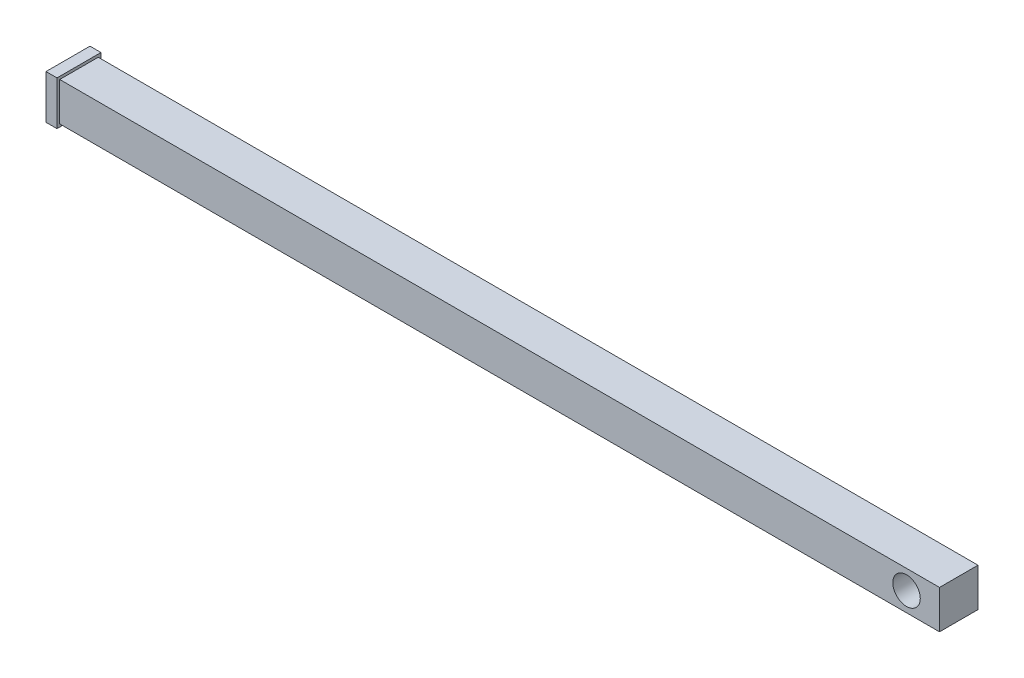
ISO-10303-21;
HEADER;
FILE_DESCRIPTION(('STEP AP214'),'2;1');
FILE_NAME('part.step','',(''),(''),'','','');
FILE_SCHEMA(('AUTOMOTIVE_DESIGN { 1 0 10303 214 1 1 1 1 }'));
ENDSEC;
DATA;
#1=APPLICATION_CONTEXT('core data for automotive mechanical design processes');
#2=APPLICATION_PROTOCOL_DEFINITION('international standard','automotive_design',2000,#1);
#3=PRODUCT_CONTEXT('',#1,'mechanical');
#4=PRODUCT('Part','Part','',(#3));
#5=PRODUCT_RELATED_PRODUCT_CATEGORY('part','',(#4));
#6=PRODUCT_DEFINITION_FORMATION('','',#4);
#7=PRODUCT_DEFINITION_CONTEXT('part definition',#1,'design');
#8=PRODUCT_DEFINITION('design','',#6,#7);
#9=PRODUCT_DEFINITION_SHAPE('','',#8);
#10=(LENGTH_UNIT() NAMED_UNIT(*) SI_UNIT(.MILLI.,.METRE.));
#11=(NAMED_UNIT(*) PLANE_ANGLE_UNIT() SI_UNIT($,.RADIAN.));
#12=(NAMED_UNIT(*) SI_UNIT($,.STERADIAN.) SOLID_ANGLE_UNIT());
#13=UNCERTAINTY_MEASURE_WITH_UNIT(LENGTH_MEASURE(1.E-05),#10,'distance_accuracy_value','');
#14=(GEOMETRIC_REPRESENTATION_CONTEXT(3) GLOBAL_UNCERTAINTY_ASSIGNED_CONTEXT((#13)) GLOBAL_UNIT_ASSIGNED_CONTEXT((#10,
#11,#12)) REPRESENTATION_CONTEXT('',''));
#15=CARTESIAN_POINT('',(0.,0.,0.));
#16=DIRECTION('',(0.,0.,1.));
#17=DIRECTION('',(1.,0.,0.));
#18=AXIS2_PLACEMENT_3D('',#15,#16,#17);
#19=CARTESIAN_POINT('',(800.,17.5,-17.5));
#20=DIRECTION('',(0.,0.,1.));
#21=DIRECTION('',(0.,-1.,0.));
#22=AXIS2_PLACEMENT_3D('',#19,#20,#21);
#23=PLANE('',#22);
#24=DIRECTION('',(0.,1.,0.));
#25=VECTOR('',#24,1.);
#26=CARTESIAN_POINT('',(0.,17.5,-17.5));
#27=LINE('',#26,#25);
#28=CARTESIAN_POINT('',(0.,-17.5,-17.5));
#29=VERTEX_POINT('',#28);
#30=CARTESIAN_POINT('',(0.,17.5,-17.5));
#31=VERTEX_POINT('',#30);
#32=EDGE_CURVE('E105',#29,#31,#27,.T.);
#33=ORIENTED_EDGE('',*,*,#32,.T.);
#34=DIRECTION('',(-1.,0.,0.));
#35=VECTOR('',#34,1.);
#36=CARTESIAN_POINT('',(800.,17.5,-17.5));
#37=LINE('',#36,#35);
#38=CARTESIAN_POINT('',(800.,17.5,-17.5));
#39=VERTEX_POINT('',#38);
#40=EDGE_CURVE('E11',#39,#31,#37,.T.);
#41=ORIENTED_EDGE('',*,*,#40,.F.);
#42=DIRECTION('',(0.,1.,0.));
#43=VECTOR('',#42,1.);
#44=CARTESIAN_POINT('',(800.,17.5,-17.5));
#45=LINE('',#44,#43);
#46=CARTESIAN_POINT('',(800.,-17.5,-17.5));
#47=VERTEX_POINT('',#46);
#48=EDGE_CURVE('E139',#47,#39,#45,.T.);
#49=ORIENTED_EDGE('',*,*,#48,.F.);
#50=DIRECTION('',(-1.,0.,0.));
#51=VECTOR('',#50,1.);
#52=CARTESIAN_POINT('',(800.,-17.5,-17.5));
#53=LINE('',#52,#51);
#54=EDGE_CURVE('E147',#47,#29,#53,.T.);
#55=ORIENTED_EDGE('',*,*,#54,.T.);
#56=EDGE_LOOP('',(#33,#41,#49,#55));
#57=FACE_BOUND('',#56,.T.);
#58=ADVANCED_FACE('F35',(#57),#23,.F.);
#59=CARTESIAN_POINT('',(800.,17.5,17.5));
#60=DIRECTION('',(0.,-1.,0.));
#61=DIRECTION('',(0.,0.,-1.));
#62=AXIS2_PLACEMENT_3D('',#59,#60,#61);
#63=PLANE('',#62);
#64=DIRECTION('',(0.,0.,1.));
#65=VECTOR('',#64,1.);
#66=CARTESIAN_POINT('',(0.,17.5,17.5));
#67=LINE('',#66,#65);
#68=CARTESIAN_POINT('',(0.,17.5,17.5));
#69=VERTEX_POINT('',#68);
#70=EDGE_CURVE('E150',#31,#69,#67,.T.);
#71=ORIENTED_EDGE('',*,*,#70,.T.);
#72=DIRECTION('',(-1.,0.,0.));
#73=VECTOR('',#72,1.);
#74=CARTESIAN_POINT('',(800.,17.5,17.5));
#75=LINE('',#74,#73);
#76=CARTESIAN_POINT('',(800.,17.5,17.5));
#77=VERTEX_POINT('',#76);
#78=EDGE_CURVE('E43',#77,#69,#75,.T.);
#79=ORIENTED_EDGE('',*,*,#78,.F.);
#80=DIRECTION('',(0.,0.,1.));
#81=VECTOR('',#80,1.);
#82=CARTESIAN_POINT('',(800.,17.5,17.5));
#83=LINE('',#82,#81);
#84=EDGE_CURVE('E141',#39,#77,#83,.T.);
#85=ORIENTED_EDGE('',*,*,#84,.F.);
#86=ORIENTED_EDGE('',*,*,#40,.T.);
#87=EDGE_LOOP('',(#71,#79,#85,#86));
#88=FACE_BOUND('',#87,.T.);
#89=ADVANCED_FACE('F170',(#88),#63,.F.);
#90=CARTESIAN_POINT('',(800.,17.5,17.5));
#91=DIRECTION('',(0.,0.,-1.));
#92=DIRECTION('',(0.,1.,0.));
#93=AXIS2_PLACEMENT_3D('',#90,#91,#92);
#94=PLANE('',#93);
#95=CARTESIAN_POINT('',(770.,0.,17.5));
#96=DIRECTION('',(0.,0.,1.));
#97=DIRECTION('',(1.,0.,0.));
#98=AXIS2_PLACEMENT_3D('',#95,#96,#97);
#99=CIRCLE('',#98,12.5);
#100=CARTESIAN_POINT('',(782.5,0.,17.5));
#101=VERTEX_POINT('',#100);
#102=EDGE_CURVE('E201',#101,#101,#99,.T.);
#103=ORIENTED_EDGE('',*,*,#102,.F.);
#104=EDGE_LOOP('',(#103));
#105=FACE_BOUND('',#104,.T.);
#106=DIRECTION('',(0.,-1.,0.));
#107=VECTOR('',#106,1.);
#108=CARTESIAN_POINT('',(0.,17.5,17.5));
#109=LINE('',#108,#107);
#110=CARTESIAN_POINT('',(0.,-17.5,17.5));
#111=VERTEX_POINT('',#110);
#112=EDGE_CURVE('E153',#69,#111,#109,.T.);
#113=ORIENTED_EDGE('',*,*,#112,.T.);
#114=DIRECTION('',(-1.,0.,0.));
#115=VECTOR('',#114,1.);
#116=CARTESIAN_POINT('',(800.,-17.5,17.5));
#117=LINE('',#116,#115);
#118=CARTESIAN_POINT('',(800.,-17.5,17.5));
#119=VERTEX_POINT('',#118);
#120=EDGE_CURVE('E160',#119,#111,#117,.T.);
#121=ORIENTED_EDGE('',*,*,#120,.F.);
#122=DIRECTION('',(0.,-1.,0.));
#123=VECTOR('',#122,1.);
#124=CARTESIAN_POINT('',(800.,17.5,17.5));
#125=LINE('',#124,#123);
#126=EDGE_CURVE('E144',#77,#119,#125,.T.);
#127=ORIENTED_EDGE('',*,*,#126,.F.);
#128=ORIENTED_EDGE('',*,*,#78,.T.);
#129=EDGE_LOOP('',(#113,#121,#127,#128));
#130=FACE_BOUND('',#129,.T.);
#131=ADVANCED_FACE('F166',(#105,#130),#94,.F.);
#132=CARTESIAN_POINT('',(800.,-17.5,17.5));
#133=DIRECTION('',(0.,1.,0.));
#134=DIRECTION('',(0.,0.,1.));
#135=AXIS2_PLACEMENT_3D('',#132,#133,#134);
#136=PLANE('',#135);
#137=DIRECTION('',(0.,0.,-1.));
#138=VECTOR('',#137,1.);
#139=CARTESIAN_POINT('',(0.,-17.5,17.5));
#140=LINE('',#139,#138);
#141=EDGE_CURVE('E142',#111,#29,#140,.T.);
#142=ORIENTED_EDGE('',*,*,#141,.T.);
#143=ORIENTED_EDGE('',*,*,#54,.F.);
#144=DIRECTION('',(0.,0.,-1.));
#145=VECTOR('',#144,1.);
#146=CARTESIAN_POINT('',(800.,-17.5,17.5));
#147=LINE('',#146,#145);
#148=EDGE_CURVE('E50',#119,#47,#147,.T.);
#149=ORIENTED_EDGE('',*,*,#148,.F.);
#150=ORIENTED_EDGE('',*,*,#120,.T.);
#151=EDGE_LOOP('',(#142,#143,#149,#150));
#152=FACE_BOUND('',#151,.T.);
#153=ADVANCED_FACE('F176',(#152),#136,.F.);
#154=CARTESIAN_POINT('',(800.,0.,0.));
#155=DIRECTION('',(1.,0.,0.));
#156=DIRECTION('',(0.,0.,-1.));
#157=AXIS2_PLACEMENT_3D('',#154,#155,#156);
#158=PLANE('',#157);
#159=ORIENTED_EDGE('',*,*,#48,.T.);
#160=ORIENTED_EDGE('',*,*,#84,.T.);
#161=ORIENTED_EDGE('',*,*,#126,.T.);
#162=ORIENTED_EDGE('',*,*,#148,.T.);
#163=EDGE_LOOP('',(#159,#160,#161,#162));
#164=FACE_BOUND('',#163,.T.);
#165=ADVANCED_FACE('F179',(#164),#158,.T.);
#166=CARTESIAN_POINT('',(-10.,0.,20.));
#167=DIRECTION('',(0.,0.,1.));
#168=DIRECTION('',(0.,-1.,0.));
#169=AXIS2_PLACEMENT_3D('',#166,#167,#168);
#170=PLANE('',#169);
#171=DIRECTION('',(0.,-1.,0.));
#172=VECTOR('',#171,1.);
#173=CARTESIAN_POINT('',(0.,0.,20.));
#174=LINE('',#173,#172);
#175=CARTESIAN_POINT('',(0.,20.,20.));
#176=VERTEX_POINT('',#175);
#177=CARTESIAN_POINT('',(0.,-20.,20.));
#178=VERTEX_POINT('',#177);
#179=EDGE_CURVE('E100',#176,#178,#174,.T.);
#180=ORIENTED_EDGE('',*,*,#179,.F.);
#181=DIRECTION('',(1.,0.,0.));
#182=VECTOR('',#181,1.);
#183=CARTESIAN_POINT('',(-10.,20.,20.));
#184=LINE('',#183,#182);
#185=CARTESIAN_POINT('',(-10.,20.,20.));
#186=VERTEX_POINT('',#185);
#187=EDGE_CURVE('E95',#186,#176,#184,.T.);
#188=ORIENTED_EDGE('',*,*,#187,.F.);
#189=DIRECTION('',(0.,-1.,0.));
#190=VECTOR('',#189,1.);
#191=CARTESIAN_POINT('',(-10.,0.,20.));
#192=LINE('',#191,#190);
#193=CARTESIAN_POINT('',(-10.,-20.,20.));
#194=VERTEX_POINT('',#193);
#195=EDGE_CURVE('E98',#186,#194,#192,.T.);
#196=ORIENTED_EDGE('',*,*,#195,.T.);
#197=DIRECTION('',(1.,0.,0.));
#198=VECTOR('',#197,1.);
#199=CARTESIAN_POINT('',(-10.,-20.,20.));
#200=LINE('',#199,#198);
#201=EDGE_CURVE('E125',#194,#178,#200,.T.);
#202=ORIENTED_EDGE('',*,*,#201,.T.);
#203=EDGE_LOOP('',(#180,#188,#196,#202));
#204=FACE_BOUND('',#203,.T.);
#205=ADVANCED_FACE('F97',(#204),#170,.T.);
#206=CARTESIAN_POINT('',(-10.,20.,0.));
#207=DIRECTION('',(0.,1.,0.));
#208=DIRECTION('',(0.,0.,1.));
#209=AXIS2_PLACEMENT_3D('',#206,#207,#208);
#210=PLANE('',#209);
#211=DIRECTION('',(0.,0.,1.));
#212=VECTOR('',#211,1.);
#213=CARTESIAN_POINT('',(0.,20.,0.));
#214=LINE('',#213,#212);
#215=CARTESIAN_POINT('',(0.,20.,-20.));
#216=VERTEX_POINT('',#215);
#217=EDGE_CURVE('E127',#216,#176,#214,.T.);
#218=ORIENTED_EDGE('',*,*,#217,.F.);
#219=DIRECTION('',(1.,0.,0.));
#220=VECTOR('',#219,1.);
#221=CARTESIAN_POINT('',(-10.,20.,-20.));
#222=LINE('',#221,#220);
#223=CARTESIAN_POINT('',(-10.,20.,-20.));
#224=VERTEX_POINT('',#223);
#225=EDGE_CURVE('E106',#224,#216,#222,.T.);
#226=ORIENTED_EDGE('',*,*,#225,.F.);
#227=DIRECTION('',(0.,0.,1.));
#228=VECTOR('',#227,1.);
#229=CARTESIAN_POINT('',(-10.,20.,0.));
#230=LINE('',#229,#228);
#231=EDGE_CURVE('E111',#224,#186,#230,.T.);
#232=ORIENTED_EDGE('',*,*,#231,.T.);
#233=ORIENTED_EDGE('',*,*,#187,.T.);
#234=EDGE_LOOP('',(#218,#226,#232,#233));
#235=FACE_BOUND('',#234,.T.);
#236=ADVANCED_FACE('F117',(#235),#210,.T.);
#237=CARTESIAN_POINT('',(-10.,0.,-20.));
#238=DIRECTION('',(0.,0.,1.));
#239=DIRECTION('',(1.,0.,0.));
#240=AXIS2_PLACEMENT_3D('',#237,#238,#239);
#241=PLANE('',#240);
#242=DIRECTION('',(0.,-1.,0.));
#243=VECTOR('',#242,1.);
#244=CARTESIAN_POINT('',(0.,0.,-20.));
#245=LINE('',#244,#243);
#246=CARTESIAN_POINT('',(0.,-20.,-20.));
#247=VERTEX_POINT('',#246);
#248=EDGE_CURVE('E130',#216,#247,#245,.T.);
#249=ORIENTED_EDGE('',*,*,#248,.T.);
#250=DIRECTION('',(1.,0.,0.));
#251=VECTOR('',#250,1.);
#252=CARTESIAN_POINT('',(-10.,-20.,-20.));
#253=LINE('',#252,#251);
#254=CARTESIAN_POINT('',(-10.,-20.,-20.));
#255=VERTEX_POINT('',#254);
#256=EDGE_CURVE('E135',#255,#247,#253,.T.);
#257=ORIENTED_EDGE('',*,*,#256,.F.);
#258=DIRECTION('',(0.,-1.,0.));
#259=VECTOR('',#258,1.);
#260=CARTESIAN_POINT('',(-10.,0.,-20.));
#261=LINE('',#260,#259);
#262=EDGE_CURVE('E119',#224,#255,#261,.T.);
#263=ORIENTED_EDGE('',*,*,#262,.F.);
#264=ORIENTED_EDGE('',*,*,#225,.T.);
#265=EDGE_LOOP('',(#249,#257,#263,#264));
#266=FACE_BOUND('',#265,.T.);
#267=ADVANCED_FACE('F224',(#266),#241,.F.);
#268=CARTESIAN_POINT('',(-10.,-20.,0.));
#269=DIRECTION('',(0.,1.,0.));
#270=DIRECTION('',(0.,0.,1.));
#271=AXIS2_PLACEMENT_3D('',#268,#269,#270);
#272=PLANE('',#271);
#273=DIRECTION('',(0.,0.,1.));
#274=VECTOR('',#273,1.);
#275=CARTESIAN_POINT('',(0.,-20.,0.));
#276=LINE('',#275,#274);
#277=EDGE_CURVE('E115',#247,#178,#276,.T.);
#278=ORIENTED_EDGE('',*,*,#277,.T.);
#279=ORIENTED_EDGE('',*,*,#201,.F.);
#280=DIRECTION('',(0.,0.,1.));
#281=VECTOR('',#280,1.);
#282=CARTESIAN_POINT('',(-10.,-20.,0.));
#283=LINE('',#282,#281);
#284=EDGE_CURVE('E113',#255,#194,#283,.T.);
#285=ORIENTED_EDGE('',*,*,#284,.F.);
#286=ORIENTED_EDGE('',*,*,#256,.T.);
#287=EDGE_LOOP('',(#278,#279,#285,#286));
#288=FACE_BOUND('',#287,.T.);
#289=ADVANCED_FACE('F220',(#288),#272,.F.);
#290=CARTESIAN_POINT('',(-10.,0.,0.));
#291=DIRECTION('',(-1.,0.,0.));
#292=DIRECTION('',(0.,0.,1.));
#293=AXIS2_PLACEMENT_3D('',#290,#291,#292);
#294=PLANE('',#293);
#295=ORIENTED_EDGE('',*,*,#195,.F.);
#296=ORIENTED_EDGE('',*,*,#231,.F.);
#297=ORIENTED_EDGE('',*,*,#262,.T.);
#298=ORIENTED_EDGE('',*,*,#284,.T.);
#299=EDGE_LOOP('',(#295,#296,#297,#298));
#300=FACE_BOUND('',#299,.T.);
#301=ADVANCED_FACE('F110',(#300),#294,.T.);
#302=CARTESIAN_POINT('',(0.,0.,0.));
#303=DIRECTION('',(-1.,0.,0.));
#304=DIRECTION('',(0.,0.,1.));
#305=AXIS2_PLACEMENT_3D('',#302,#303,#304);
#306=PLANE('',#305);
#307=ORIENTED_EDGE('',*,*,#32,.F.);
#308=ORIENTED_EDGE('',*,*,#141,.F.);
#309=ORIENTED_EDGE('',*,*,#112,.F.);
#310=ORIENTED_EDGE('',*,*,#70,.F.);
#311=EDGE_LOOP('',(#307,#308,#309,#310));
#312=FACE_BOUND('',#311,.T.);
#313=ORIENTED_EDGE('',*,*,#179,.T.);
#314=ORIENTED_EDGE('',*,*,#277,.F.);
#315=ORIENTED_EDGE('',*,*,#248,.F.);
#316=ORIENTED_EDGE('',*,*,#217,.T.);
#317=EDGE_LOOP('',(#313,#314,#315,#316));
#318=FACE_BOUND('',#317,.T.);
#319=ADVANCED_FACE('F173',(#312,#318),#306,.F.);
#320=CARTESIAN_POINT('',(770.,0.,-7.5));
#321=DIRECTION('',(0.,0.,1.));
#322=DIRECTION('',(1.,0.,0.));
#323=AXIS2_PLACEMENT_3D('',#320,#321,#322);
#324=CYLINDRICAL_SURFACE('',#323,12.5);
#325=CARTESIAN_POINT('',(770.,0.,-7.5));
#326=DIRECTION('',(0.,0.,1.));
#327=DIRECTION('',(1.,0.,0.));
#328=AXIS2_PLACEMENT_3D('',#325,#326,#327);
#329=CIRCLE('',#328,12.5);
#330=CARTESIAN_POINT('',(782.5,0.,-7.5));
#331=VERTEX_POINT('',#330);
#332=EDGE_CURVE('E128',#331,#331,#329,.T.);
#333=ORIENTED_EDGE('',*,*,#332,.F.);
#334=EDGE_LOOP('',(#333));
#335=FACE_BOUND('',#334,.T.);
#336=ORIENTED_EDGE('',*,*,#102,.T.);
#337=EDGE_LOOP('',(#336));
#338=FACE_BOUND('',#337,.T.);
#339=ADVANCED_FACE('F209',(#335,#338),#324,.F.);
#340=CARTESIAN_POINT('',(770.,0.,-7.5));
#341=DIRECTION('',(0.,0.,1.));
#342=DIRECTION('',(1.,0.,0.));
#343=AXIS2_PLACEMENT_3D('',#340,#341,#342);
#344=PLANE('',#343);
#345=ORIENTED_EDGE('',*,*,#332,.T.);
#346=EDGE_LOOP('',(#345));
#347=FACE_BOUND('',#346,.T.);
#348=ADVANCED_FACE('F207',(#347),#344,.T.);
#349=CLOSED_SHELL('',(#58,#89,#131,#153,#165,#205,#236,#267,#289,#301,#319,#339,#348));
#350=MANIFOLD_SOLID_BREP('B2',#349);
#351=ADVANCED_BREP_SHAPE_REPRESENTATION('',(#18,#350),#14);
#352=SHAPE_DEFINITION_REPRESENTATION(#9,#351);
ENDSEC;
END-ISO-10303-21;
